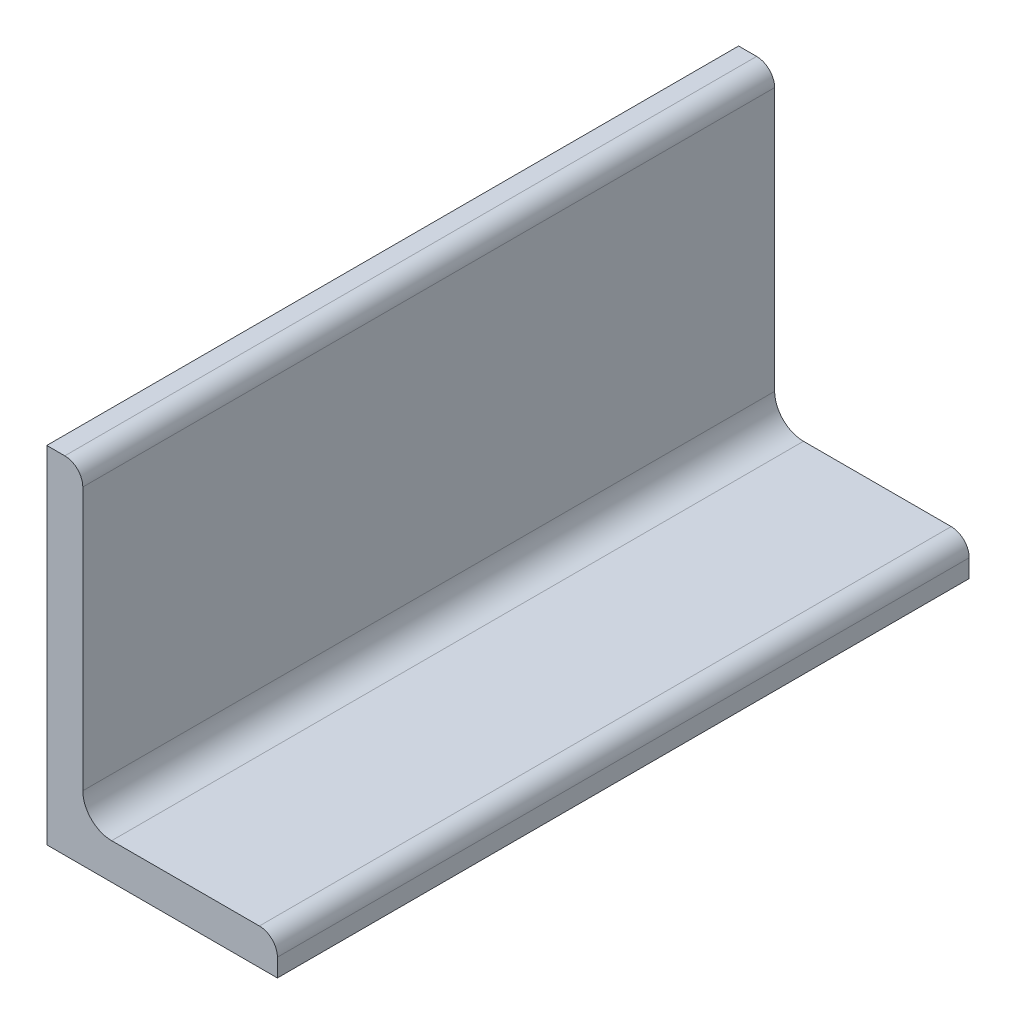
ISO-10303-21;
HEADER;
FILE_DESCRIPTION(('STEP AP214'),'2;1');
FILE_NAME('part.step','',(''),(''),'','','');
FILE_SCHEMA(('AUTOMOTIVE_DESIGN { 1 0 10303 214 1 1 1 1 }'));
ENDSEC;
DATA;
#1=APPLICATION_CONTEXT('core data for automotive mechanical design processes');
#2=APPLICATION_PROTOCOL_DEFINITION('international standard','automotive_design',2000,#1);
#3=PRODUCT_CONTEXT('',#1,'mechanical');
#4=PRODUCT('Part','Part','',(#3));
#5=PRODUCT_RELATED_PRODUCT_CATEGORY('part','',(#4));
#6=PRODUCT_DEFINITION_FORMATION('','',#4);
#7=PRODUCT_DEFINITION_CONTEXT('part definition',#1,'design');
#8=PRODUCT_DEFINITION('design','',#6,#7);
#9=PRODUCT_DEFINITION_SHAPE('','',#8);
#10=(LENGTH_UNIT() NAMED_UNIT(*) SI_UNIT(.MILLI.,.METRE.));
#11=(NAMED_UNIT(*) PLANE_ANGLE_UNIT() SI_UNIT($,.RADIAN.));
#12=(NAMED_UNIT(*) SI_UNIT($,.STERADIAN.) SOLID_ANGLE_UNIT());
#13=UNCERTAINTY_MEASURE_WITH_UNIT(LENGTH_MEASURE(1.E-05),#10,'distance_accuracy_value','');
#14=(GEOMETRIC_REPRESENTATION_CONTEXT(3) GLOBAL_UNCERTAINTY_ASSIGNED_CONTEXT((#13)) GLOBAL_UNIT_ASSIGNED_CONTEXT((#10,
#11,#12)) REPRESENTATION_CONTEXT('',''));
#15=CARTESIAN_POINT('',(0.,0.,0.));
#16=DIRECTION('',(0.,0.,1.));
#17=DIRECTION('',(1.,0.,0.));
#18=AXIS2_PLACEMENT_3D('',#15,#16,#17);
#19=CARTESIAN_POINT('',(0.865045893659089,152.925428131371,304.8));
#20=DIRECTION('',(1.,0.,0.));
#21=DIRECTION('',(0.,0.,-1.));
#22=AXIS2_PLACEMENT_3D('',#19,#20,#21);
#23=PLANE('',#22);
#24=DIRECTION('',(0.,-1.,0.));
#25=VECTOR('',#24,1.);
#26=CARTESIAN_POINT('',(0.865045893659089,152.925428131371,0.));
#27=LINE('',#26,#25);
#28=CARTESIAN_POINT('',(0.865045893659089,152.925428131371,0.));
#29=VERTEX_POINT('',#28);
#30=CARTESIAN_POINT('',(0.865045893659089,0.525428131371291,0.));
#31=VERTEX_POINT('',#30);
#32=EDGE_CURVE('E135',#29,#31,#27,.T.);
#33=ORIENTED_EDGE('',*,*,#32,.T.);
#34=DIRECTION('',(0.,0.,-1.));
#35=VECTOR('',#34,1.);
#36=CARTESIAN_POINT('',(0.865045893659089,0.525428131371291,304.8));
#37=LINE('',#36,#35);
#38=CARTESIAN_POINT('',(0.865045893659089,0.525428131371291,304.8));
#39=VERTEX_POINT('',#38);
#40=EDGE_CURVE('E11',#39,#31,#37,.T.);
#41=ORIENTED_EDGE('',*,*,#40,.F.);
#42=DIRECTION('',(0.,-1.,0.));
#43=VECTOR('',#42,1.);
#44=CARTESIAN_POINT('',(0.865045893659089,152.925428131371,304.8));
#45=LINE('',#44,#43);
#46=CARTESIAN_POINT('',(0.865045893659089,152.925428131371,304.8));
#47=VERTEX_POINT('',#46);
#48=EDGE_CURVE('E151',#47,#39,#45,.T.);
#49=ORIENTED_EDGE('',*,*,#48,.F.);
#50=DIRECTION('',(0.,0.,-1.));
#51=VECTOR('',#50,1.);
#52=CARTESIAN_POINT('',(0.865045893659089,152.925428131371,304.8));
#53=LINE('',#52,#51);
#54=EDGE_CURVE('E131',#47,#29,#53,.T.);
#55=ORIENTED_EDGE('',*,*,#54,.T.);
#56=EDGE_LOOP('',(#33,#41,#49,#55));
#57=FACE_BOUND('',#56,.T.);
#58=ADVANCED_FACE('F33',(#57),#23,.F.);
#59=CARTESIAN_POINT('',(0.865045893659089,0.525428131371291,304.8));
#60=DIRECTION('',(0.,1.,0.));
#61=DIRECTION('',(0.,0.,1.));
#62=AXIS2_PLACEMENT_3D('',#59,#60,#61);
#63=PLANE('',#62);
#64=DIRECTION('',(1.,0.,0.));
#65=VECTOR('',#64,1.);
#66=CARTESIAN_POINT('',(0.865045893659089,0.525428131371291,0.));
#67=LINE('',#66,#65);
#68=CARTESIAN_POINT('',(102.465045893659,0.525428131371291,0.));
#69=VERTEX_POINT('',#68);
#70=EDGE_CURVE('E138',#31,#69,#67,.T.);
#71=ORIENTED_EDGE('',*,*,#70,.T.);
#72=DIRECTION('',(0.,0.,-1.));
#73=VECTOR('',#72,1.);
#74=CARTESIAN_POINT('',(102.465045893659,0.525428131371291,304.8));
#75=LINE('',#74,#73);
#76=CARTESIAN_POINT('',(102.465045893659,0.525428131371291,304.8));
#77=VERTEX_POINT('',#76);
#78=EDGE_CURVE('E41',#77,#69,#75,.T.);
#79=ORIENTED_EDGE('',*,*,#78,.F.);
#80=DIRECTION('',(1.,0.,0.));
#81=VECTOR('',#80,1.);
#82=CARTESIAN_POINT('',(0.865045893659089,0.525428131371291,304.8));
#83=LINE('',#82,#81);
#84=EDGE_CURVE('E95',#39,#77,#83,.T.);
#85=ORIENTED_EDGE('',*,*,#84,.F.);
#86=ORIENTED_EDGE('',*,*,#40,.T.);
#87=EDGE_LOOP('',(#71,#79,#85,#86));
#88=FACE_BOUND('',#87,.T.);
#89=ADVANCED_FACE('F194',(#88),#63,.F.);
#90=CARTESIAN_POINT('',(102.465045893659,0.525428131371291,304.8));
#91=DIRECTION('',(-1.,0.,0.));
#92=DIRECTION('',(0.,0.,1.));
#93=AXIS2_PLACEMENT_3D('',#90,#91,#92);
#94=PLANE('',#93);
#95=DIRECTION('',(0.,1.,0.));
#96=VECTOR('',#95,1.);
#97=CARTESIAN_POINT('',(102.465045893659,0.525428131371291,0.));
#98=LINE('',#97,#96);
#99=CARTESIAN_POINT('',(102.465045893659,8.46292813137129,0.));
#100=VERTEX_POINT('',#99);
#101=EDGE_CURVE('E140',#69,#100,#98,.T.);
#102=ORIENTED_EDGE('',*,*,#101,.T.);
#103=DIRECTION('',(0.,0.,-1.));
#104=VECTOR('',#103,1.);
#105=CARTESIAN_POINT('',(102.465045893659,8.46292813137129,304.8));
#106=LINE('',#105,#104);
#107=CARTESIAN_POINT('',(102.465045893659,8.46292813137129,304.8));
#108=VERTEX_POINT('',#107);
#109=EDGE_CURVE('E161',#108,#100,#106,.T.);
#110=ORIENTED_EDGE('',*,*,#109,.F.);
#111=DIRECTION('',(0.,1.,0.));
#112=VECTOR('',#111,1.);
#113=CARTESIAN_POINT('',(102.465045893659,0.525428131371291,304.8));
#114=LINE('',#113,#112);
#115=EDGE_CURVE('E169',#77,#108,#114,.T.);
#116=ORIENTED_EDGE('',*,*,#115,.F.);
#117=ORIENTED_EDGE('',*,*,#78,.T.);
#118=EDGE_LOOP('',(#102,#110,#116,#117));
#119=FACE_BOUND('',#118,.T.);
#120=ADVANCED_FACE('F167',(#119),#94,.F.);
#121=CARTESIAN_POINT('',(94.5275458936591,8.46292813137129,304.8));
#122=DIRECTION('',(0.,0.,-1.));
#123=DIRECTION('',(-1.,0.,0.));
#124=AXIS2_PLACEMENT_3D('',#121,#122,#123);
#125=CYLINDRICAL_SURFACE('',#124,7.93750000000001);
#126=CARTESIAN_POINT('',(94.5275458936591,8.46292813137129,0.));
#127=DIRECTION('',(0.,0.,1.));
#128=DIRECTION('',(1.,0.,0.));
#129=AXIS2_PLACEMENT_3D('',#126,#127,#128);
#130=CIRCLE('',#129,7.93750000000001);
#131=CARTESIAN_POINT('',(94.5275458936591,16.4004281313713,0.));
#132=VERTEX_POINT('',#131);
#133=EDGE_CURVE('E142',#100,#132,#130,.T.);
#134=ORIENTED_EDGE('',*,*,#133,.T.);
#135=DIRECTION('',(0.,0.,-1.));
#136=VECTOR('',#135,1.);
#137=CARTESIAN_POINT('',(94.5275458936591,16.4004281313713,304.8));
#138=LINE('',#137,#136);
#139=CARTESIAN_POINT('',(94.5275458936591,16.4004281313713,304.8));
#140=VERTEX_POINT('',#139);
#141=EDGE_CURVE('E158',#140,#132,#138,.T.);
#142=ORIENTED_EDGE('',*,*,#141,.F.);
#143=CARTESIAN_POINT('',(94.5275458936591,8.46292813137129,304.8));
#144=DIRECTION('',(0.,0.,1.));
#145=DIRECTION('',(1.,0.,0.));
#146=AXIS2_PLACEMENT_3D('',#143,#144,#145);
#147=CIRCLE('',#146,7.93750000000001);
#148=EDGE_CURVE('E185',#108,#140,#147,.T.);
#149=ORIENTED_EDGE('',*,*,#148,.F.);
#150=ORIENTED_EDGE('',*,*,#109,.T.);
#151=EDGE_LOOP('',(#134,#142,#149,#150));
#152=FACE_BOUND('',#151,.T.);
#153=ADVANCED_FACE('F178',(#152),#125,.T.);
#154=CARTESIAN_POINT('',(94.5275458936591,16.4004281313713,304.8));
#155=DIRECTION('',(0.,-1.,0.));
#156=DIRECTION('',(0.,0.,-1.));
#157=AXIS2_PLACEMENT_3D('',#154,#155,#156);
#158=PLANE('',#157);
#159=DIRECTION('',(-1.,0.,0.));
#160=VECTOR('',#159,1.);
#161=CARTESIAN_POINT('',(94.5275458936591,16.4004281313713,0.));
#162=LINE('',#161,#160);
#163=CARTESIAN_POINT('',(29.4400458936591,16.4004281313713,0.));
#164=VERTEX_POINT('',#163);
#165=EDGE_CURVE('E144',#132,#164,#162,.T.);
#166=ORIENTED_EDGE('',*,*,#165,.T.);
#167=DIRECTION('',(0.,0.,-1.));
#168=VECTOR('',#167,1.);
#169=CARTESIAN_POINT('',(29.4400458936591,16.4004281313713,304.8));
#170=LINE('',#169,#168);
#171=CARTESIAN_POINT('',(29.4400458936591,16.4004281313713,304.8));
#172=VERTEX_POINT('',#171);
#173=EDGE_CURVE('E155',#172,#164,#170,.T.);
#174=ORIENTED_EDGE('',*,*,#173,.F.);
#175=DIRECTION('',(-1.,0.,0.));
#176=VECTOR('',#175,1.);
#177=CARTESIAN_POINT('',(94.5275458936591,16.4004281313713,304.8));
#178=LINE('',#177,#176);
#179=EDGE_CURVE('E184',#140,#172,#178,.T.);
#180=ORIENTED_EDGE('',*,*,#179,.F.);
#181=ORIENTED_EDGE('',*,*,#141,.T.);
#182=EDGE_LOOP('',(#166,#174,#180,#181));
#183=FACE_BOUND('',#182,.T.);
#184=ADVANCED_FACE('F182',(#183),#158,.F.);
#185=CARTESIAN_POINT('',(29.4400458936591,29.1004281313713,304.8));
#186=DIRECTION('',(0.,0.,-1.));
#187=DIRECTION('',(-1.,0.,0.));
#188=AXIS2_PLACEMENT_3D('',#185,#186,#187);
#189=CYLINDRICAL_SURFACE('',#188,12.7);
#190=CARTESIAN_POINT('',(29.4400458936591,29.1004281313713,0.));
#191=DIRECTION('',(0.,0.,-1.));
#192=DIRECTION('',(1.,0.,0.));
#193=AXIS2_PLACEMENT_3D('',#190,#191,#192);
#194=CIRCLE('',#193,12.7);
#195=CARTESIAN_POINT('',(16.7400458936591,29.1004281313713,0.));
#196=VERTEX_POINT('',#195);
#197=EDGE_CURVE('E146',#164,#196,#194,.T.);
#198=ORIENTED_EDGE('',*,*,#197,.T.);
#199=DIRECTION('',(0.,0.,-1.));
#200=VECTOR('',#199,1.);
#201=CARTESIAN_POINT('',(16.7400458936591,29.1004281313713,304.8));
#202=LINE('',#201,#200);
#203=CARTESIAN_POINT('',(16.7400458936591,29.1004281313713,304.8));
#204=VERTEX_POINT('',#203);
#205=EDGE_CURVE('E126',#204,#196,#202,.T.);
#206=ORIENTED_EDGE('',*,*,#205,.F.);
#207=CARTESIAN_POINT('',(29.4400458936591,29.1004281313713,304.8));
#208=DIRECTION('',(0.,0.,-1.));
#209=DIRECTION('',(1.,0.,0.));
#210=AXIS2_PLACEMENT_3D('',#207,#208,#209);
#211=CIRCLE('',#210,12.7);
#212=EDGE_CURVE('E117',#172,#204,#211,.T.);
#213=ORIENTED_EDGE('',*,*,#212,.F.);
#214=ORIENTED_EDGE('',*,*,#173,.T.);
#215=EDGE_LOOP('',(#198,#206,#213,#214));
#216=FACE_BOUND('',#215,.T.);
#217=ADVANCED_FACE('F206',(#216),#189,.F.);
#218=CARTESIAN_POINT('',(16.7400458936591,29.1004281313713,304.8));
#219=DIRECTION('',(-1.,0.,0.));
#220=DIRECTION('',(0.,0.,1.));
#221=AXIS2_PLACEMENT_3D('',#218,#219,#220);
#222=PLANE('',#221);
#223=DIRECTION('',(0.,1.,0.));
#224=VECTOR('',#223,1.);
#225=CARTESIAN_POINT('',(16.7400458936591,29.1004281313713,0.));
#226=LINE('',#225,#224);
#227=CARTESIAN_POINT('',(16.7400458936591,144.987928131371,0.));
#228=VERTEX_POINT('',#227);
#229=EDGE_CURVE('E125',#196,#228,#226,.T.);
#230=ORIENTED_EDGE('',*,*,#229,.T.);
#231=DIRECTION('',(0.,0.,-1.));
#232=VECTOR('',#231,1.);
#233=CARTESIAN_POINT('',(16.7400458936591,144.987928131371,304.8));
#234=LINE('',#233,#232);
#235=CARTESIAN_POINT('',(16.7400458936591,144.987928131371,304.8));
#236=VERTEX_POINT('',#235);
#237=EDGE_CURVE('E122',#236,#228,#234,.T.);
#238=ORIENTED_EDGE('',*,*,#237,.F.);
#239=DIRECTION('',(0.,1.,0.));
#240=VECTOR('',#239,1.);
#241=CARTESIAN_POINT('',(16.7400458936591,29.1004281313713,304.8));
#242=LINE('',#241,#240);
#243=EDGE_CURVE('E111',#204,#236,#242,.T.);
#244=ORIENTED_EDGE('',*,*,#243,.F.);
#245=ORIENTED_EDGE('',*,*,#205,.T.);
#246=EDGE_LOOP('',(#230,#238,#244,#245));
#247=FACE_BOUND('',#246,.T.);
#248=ADVANCED_FACE('F123',(#247),#222,.F.);
#249=CARTESIAN_POINT('',(8.80254589365908,144.987928131371,304.8));
#250=DIRECTION('',(0.,0.,-1.));
#251=DIRECTION('',(-1.,0.,0.));
#252=AXIS2_PLACEMENT_3D('',#249,#250,#251);
#253=CYLINDRICAL_SURFACE('',#252,7.93749999999999);
#254=CARTESIAN_POINT('',(8.80254589365908,144.987928131371,0.));
#255=DIRECTION('',(0.,0.,1.));
#256=DIRECTION('',(1.,0.,0.));
#257=AXIS2_PLACEMENT_3D('',#254,#255,#256);
#258=CIRCLE('',#257,7.93749999999999);
#259=CARTESIAN_POINT('',(8.80254589365909,152.925428131371,0.));
#260=VERTEX_POINT('',#259);
#261=EDGE_CURVE('E81',#228,#260,#258,.T.);
#262=ORIENTED_EDGE('',*,*,#261,.T.);
#263=DIRECTION('',(0.,0.,-1.));
#264=VECTOR('',#263,1.);
#265=CARTESIAN_POINT('',(8.80254589365909,152.925428131371,304.8));
#266=LINE('',#265,#264);
#267=CARTESIAN_POINT('',(8.80254589365909,152.925428131371,304.8));
#268=VERTEX_POINT('',#267);
#269=EDGE_CURVE('E127',#268,#260,#266,.T.);
#270=ORIENTED_EDGE('',*,*,#269,.F.);
#271=CARTESIAN_POINT('',(8.80254589365908,144.987928131371,304.8));
#272=DIRECTION('',(0.,0.,1.));
#273=DIRECTION('',(1.,0.,0.));
#274=AXIS2_PLACEMENT_3D('',#271,#272,#273);
#275=CIRCLE('',#274,7.93749999999999);
#276=EDGE_CURVE('E115',#236,#268,#275,.T.);
#277=ORIENTED_EDGE('',*,*,#276,.F.);
#278=ORIENTED_EDGE('',*,*,#237,.T.);
#279=EDGE_LOOP('',(#262,#270,#277,#278));
#280=FACE_BOUND('',#279,.T.);
#281=ADVANCED_FACE('F129',(#280),#253,.T.);
#282=CARTESIAN_POINT('',(8.80254589365909,152.925428131371,304.8));
#283=DIRECTION('',(0.,-1.,0.));
#284=DIRECTION('',(0.,0.,-1.));
#285=AXIS2_PLACEMENT_3D('',#282,#283,#284);
#286=PLANE('',#285);
#287=DIRECTION('',(-1.,0.,0.));
#288=VECTOR('',#287,1.);
#289=CARTESIAN_POINT('',(8.80254589365909,152.925428131371,0.));
#290=LINE('',#289,#288);
#291=EDGE_CURVE('E87',#260,#29,#290,.T.);
#292=ORIENTED_EDGE('',*,*,#291,.T.);
#293=ORIENTED_EDGE('',*,*,#54,.F.);
#294=DIRECTION('',(-1.,0.,0.));
#295=VECTOR('',#294,1.);
#296=CARTESIAN_POINT('',(8.80254589365909,152.925428131371,304.8));
#297=LINE('',#296,#295);
#298=EDGE_CURVE('E49',#268,#47,#297,.T.);
#299=ORIENTED_EDGE('',*,*,#298,.F.);
#300=ORIENTED_EDGE('',*,*,#269,.T.);
#301=EDGE_LOOP('',(#292,#293,#299,#300));
#302=FACE_BOUND('',#301,.T.);
#303=ADVANCED_FACE('F214',(#302),#286,.F.);
#304=CARTESIAN_POINT('',(94.5275458936591,8.46292813137129,304.8));
#305=DIRECTION('',(0.,0.,1.));
#306=DIRECTION('',(1.,0.,0.));
#307=AXIS2_PLACEMENT_3D('',#304,#305,#306);
#308=PLANE('',#307);
#309=ORIENTED_EDGE('',*,*,#48,.T.);
#310=ORIENTED_EDGE('',*,*,#84,.T.);
#311=ORIENTED_EDGE('',*,*,#115,.T.);
#312=ORIENTED_EDGE('',*,*,#148,.T.);
#313=ORIENTED_EDGE('',*,*,#179,.T.);
#314=ORIENTED_EDGE('',*,*,#212,.T.);
#315=ORIENTED_EDGE('',*,*,#243,.T.);
#316=ORIENTED_EDGE('',*,*,#276,.T.);
#317=ORIENTED_EDGE('',*,*,#298,.T.);
#318=EDGE_LOOP('',(#309,#310,#311,#312,#313,#314,#315,#316,#317));
#319=FACE_BOUND('',#318,.T.);
#320=ADVANCED_FACE('F113',(#319),#308,.T.);
#321=CARTESIAN_POINT('',(94.5275458936591,8.46292813137129,0.));
#322=DIRECTION('',(0.,0.,1.));
#323=DIRECTION('',(1.,0.,0.));
#324=AXIS2_PLACEMENT_3D('',#321,#322,#323);
#325=PLANE('',#324);
#326=ORIENTED_EDGE('',*,*,#32,.F.);
#327=ORIENTED_EDGE('',*,*,#291,.F.);
#328=ORIENTED_EDGE('',*,*,#261,.F.);
#329=ORIENTED_EDGE('',*,*,#229,.F.);
#330=ORIENTED_EDGE('',*,*,#197,.F.);
#331=ORIENTED_EDGE('',*,*,#165,.F.);
#332=ORIENTED_EDGE('',*,*,#133,.F.);
#333=ORIENTED_EDGE('',*,*,#101,.F.);
#334=ORIENTED_EDGE('',*,*,#70,.F.);
#335=EDGE_LOOP('',(#326,#327,#328,#329,#330,#331,#332,#333,#334));
#336=FACE_BOUND('',#335,.T.);
#337=ADVANCED_FACE('F173',(#336),#325,.F.);
#338=CLOSED_SHELL('',(#58,#89,#120,#153,#184,#217,#248,#281,#303,#320,#337));
#339=MANIFOLD_SOLID_BREP('B2',#338);
#340=ADVANCED_BREP_SHAPE_REPRESENTATION('',(#18,#339),#14);
#341=SHAPE_DEFINITION_REPRESENTATION(#9,#340);
ENDSEC;
END-ISO-10303-21;
